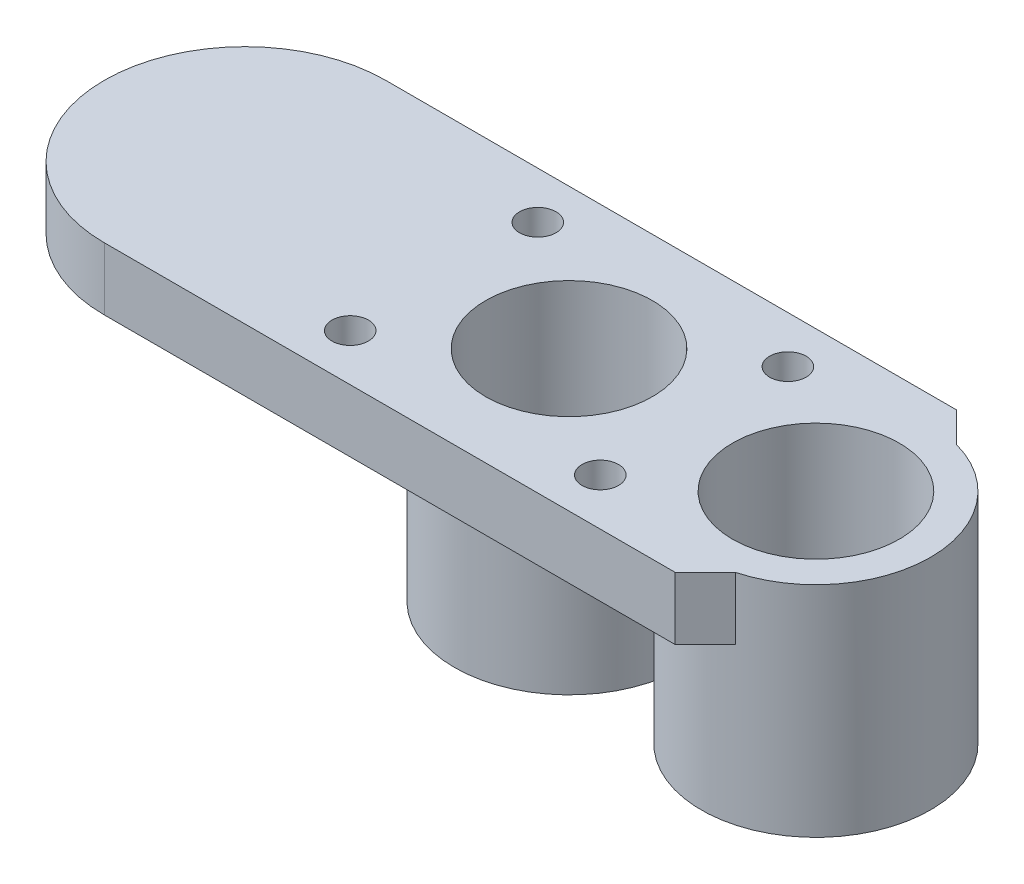
ISO-10303-21;
HEADER;
FILE_DESCRIPTION(('STEP AP214'),'2;1');
FILE_NAME('part.step','',(''),(''),'','','');
FILE_SCHEMA(('AUTOMOTIVE_DESIGN { 1 0 10303 214 1 1 1 1 }'));
ENDSEC;
DATA;
#1=APPLICATION_CONTEXT('core data for automotive mechanical design processes');
#2=APPLICATION_PROTOCOL_DEFINITION('international standard','automotive_design',2000,#1);
#3=PRODUCT_CONTEXT('',#1,'mechanical');
#4=PRODUCT('Part','Part','',(#3));
#5=PRODUCT_RELATED_PRODUCT_CATEGORY('part','',(#4));
#6=PRODUCT_DEFINITION_FORMATION('','',#4);
#7=PRODUCT_DEFINITION_CONTEXT('part definition',#1,'design');
#8=PRODUCT_DEFINITION('design','',#6,#7);
#9=PRODUCT_DEFINITION_SHAPE('','',#8);
#10=(LENGTH_UNIT() NAMED_UNIT(*) SI_UNIT(.MILLI.,.METRE.));
#11=(NAMED_UNIT(*) PLANE_ANGLE_UNIT() SI_UNIT($,.RADIAN.));
#12=(NAMED_UNIT(*) SI_UNIT($,.STERADIAN.) SOLID_ANGLE_UNIT());
#13=UNCERTAINTY_MEASURE_WITH_UNIT(LENGTH_MEASURE(1.E-05),#10,'distance_accuracy_value','');
#14=(GEOMETRIC_REPRESENTATION_CONTEXT(3) GLOBAL_UNCERTAINTY_ASSIGNED_CONTEXT((#13)) GLOBAL_UNIT_ASSIGNED_CONTEXT((#10,
#11,#12)) REPRESENTATION_CONTEXT('',''));
#15=CARTESIAN_POINT('',(0.,0.,0.));
#16=DIRECTION('',(0.,0.,1.));
#17=DIRECTION('',(1.,0.,0.));
#18=AXIS2_PLACEMENT_3D('',#15,#16,#17);
#19=CARTESIAN_POINT('',(12.,6.,-9.));
#20=DIRECTION('',(0.,-1.,0.));
#21=DIRECTION('',(0.,0.,-1.));
#22=AXIS2_PLACEMENT_3D('',#19,#20,#21);
#23=CYLINDRICAL_SURFACE('',#22,1.75);
#24=CARTESIAN_POINT('',(12.,6.,-9.));
#25=DIRECTION('',(0.,1.,0.));
#26=DIRECTION('',(0.,0.,1.));
#27=AXIS2_PLACEMENT_3D('',#24,#25,#26);
#28=CIRCLE('',#27,1.75);
#29=CARTESIAN_POINT('',(12.,6.,-7.25));
#30=VERTEX_POINT('',#29);
#31=EDGE_CURVE('E105',#30,#30,#28,.T.);
#32=ORIENTED_EDGE('',*,*,#31,.T.);
#33=EDGE_LOOP('',(#32));
#34=FACE_BOUND('',#33,.T.);
#35=CARTESIAN_POINT('',(12.,3.,-9.));
#36=DIRECTION('',(0.,-1.,0.));
#37=DIRECTION('',(0.,0.,-1.));
#38=AXIS2_PLACEMENT_3D('',#35,#36,#37);
#39=CIRCLE('',#38,1.75);
#40=CARTESIAN_POINT('',(12.,3.,-10.75));
#41=VERTEX_POINT('',#40);
#42=EDGE_CURVE('E138',#41,#41,#39,.T.);
#43=ORIENTED_EDGE('',*,*,#42,.T.);
#44=EDGE_LOOP('',(#43));
#45=FACE_BOUND('',#44,.T.);
#46=ADVANCED_FACE('F41',(#34,#45),#23,.F.);
#47=CARTESIAN_POINT('',(12.,6.,9.));
#48=DIRECTION('',(0.,-1.,0.));
#49=DIRECTION('',(0.,0.,-1.));
#50=AXIS2_PLACEMENT_3D('',#47,#48,#49);
#51=CYLINDRICAL_SURFACE('',#50,1.75);
#52=CARTESIAN_POINT('',(12.,6.,9.));
#53=DIRECTION('',(0.,1.,0.));
#54=DIRECTION('',(0.,0.,1.));
#55=AXIS2_PLACEMENT_3D('',#52,#53,#54);
#56=CIRCLE('',#55,1.75);
#57=CARTESIAN_POINT('',(12.,6.,10.75));
#58=VERTEX_POINT('',#57);
#59=EDGE_CURVE('E197',#58,#58,#56,.T.);
#60=ORIENTED_EDGE('',*,*,#59,.T.);
#61=EDGE_LOOP('',(#60));
#62=FACE_BOUND('',#61,.T.);
#63=CARTESIAN_POINT('',(12.,3.,9.));
#64=DIRECTION('',(0.,-1.,0.));
#65=DIRECTION('',(0.,0.,-1.));
#66=AXIS2_PLACEMENT_3D('',#63,#64,#65);
#67=CIRCLE('',#66,1.75);
#68=CARTESIAN_POINT('',(12.,3.,7.25));
#69=VERTEX_POINT('',#68);
#70=EDGE_CURVE('E154',#69,#69,#67,.T.);
#71=ORIENTED_EDGE('',*,*,#70,.T.);
#72=EDGE_LOOP('',(#71));
#73=FACE_BOUND('',#72,.T.);
#74=ADVANCED_FACE('F257',(#62,#73),#51,.F.);
#75=CARTESIAN_POINT('',(-12.,6.,9.));
#76=DIRECTION('',(0.,-1.,0.));
#77=DIRECTION('',(0.,0.,-1.));
#78=AXIS2_PLACEMENT_3D('',#75,#76,#77);
#79=CYLINDRICAL_SURFACE('',#78,1.75);
#80=CARTESIAN_POINT('',(-12.,6.,9.));
#81=DIRECTION('',(0.,1.,0.));
#82=DIRECTION('',(0.,0.,1.));
#83=AXIS2_PLACEMENT_3D('',#80,#81,#82);
#84=CIRCLE('',#83,1.75);
#85=CARTESIAN_POINT('',(-12.,6.,10.75));
#86=VERTEX_POINT('',#85);
#87=EDGE_CURVE('E192',#86,#86,#84,.T.);
#88=ORIENTED_EDGE('',*,*,#87,.T.);
#89=EDGE_LOOP('',(#88));
#90=FACE_BOUND('',#89,.T.);
#91=CARTESIAN_POINT('',(-12.,3.,9.));
#92=DIRECTION('',(0.,-1.,0.));
#93=DIRECTION('',(0.,0.,-1.));
#94=AXIS2_PLACEMENT_3D('',#91,#92,#93);
#95=CIRCLE('',#94,1.75);
#96=CARTESIAN_POINT('',(-12.,3.,7.25));
#97=VERTEX_POINT('',#96);
#98=EDGE_CURVE('E140',#97,#97,#95,.T.);
#99=ORIENTED_EDGE('',*,*,#98,.T.);
#100=EDGE_LOOP('',(#99));
#101=FACE_BOUND('',#100,.T.);
#102=ADVANCED_FACE('F263',(#90,#101),#79,.F.);
#103=CARTESIAN_POINT('',(-12.,6.,-9.));
#104=DIRECTION('',(0.,-1.,0.));
#105=DIRECTION('',(0.,0.,-1.));
#106=AXIS2_PLACEMENT_3D('',#103,#104,#105);
#107=CYLINDRICAL_SURFACE('',#106,1.75);
#108=CARTESIAN_POINT('',(-12.,6.,-9.));
#109=DIRECTION('',(0.,1.,0.));
#110=DIRECTION('',(0.,0.,1.));
#111=AXIS2_PLACEMENT_3D('',#108,#109,#110);
#112=CIRCLE('',#111,1.75);
#113=CARTESIAN_POINT('',(-12.,6.,-7.25));
#114=VERTEX_POINT('',#113);
#115=EDGE_CURVE('E188',#114,#114,#112,.T.);
#116=ORIENTED_EDGE('',*,*,#115,.T.);
#117=EDGE_LOOP('',(#116));
#118=FACE_BOUND('',#117,.T.);
#119=CARTESIAN_POINT('',(-12.,3.,-9.));
#120=DIRECTION('',(0.,-1.,0.));
#121=DIRECTION('',(0.,0.,-1.));
#122=AXIS2_PLACEMENT_3D('',#119,#120,#121);
#123=CIRCLE('',#122,1.75);
#124=CARTESIAN_POINT('',(-12.,3.,-10.75));
#125=VERTEX_POINT('',#124);
#126=EDGE_CURVE('E150',#125,#125,#123,.T.);
#127=ORIENTED_EDGE('',*,*,#126,.T.);
#128=EDGE_LOOP('',(#127));
#129=FACE_BOUND('',#128,.T.);
#130=ADVANCED_FACE('F271',(#118,#129),#107,.F.);
#131=CARTESIAN_POINT('',(0.,6.,13.5));
#132=DIRECTION('',(0.,0.,-1.));
#133=DIRECTION('',(-1.,0.,0.));
#134=AXIS2_PLACEMENT_3D('',#131,#132,#133);
#135=PLANE('',#134);
#136=DIRECTION('',(1.,0.,0.));
#137=VECTOR('',#136,1.);
#138=CARTESIAN_POINT('',(0.,0.,13.5));
#139=LINE('',#138,#137);
#140=CARTESIAN_POINT('',(-31.1,0.,13.5));
#141=VERTEX_POINT('',#140);
#142=CARTESIAN_POINT('',(23.69,0.,13.5));
#143=VERTEX_POINT('',#142);
#144=EDGE_CURVE('E184',#141,#143,#139,.T.);
#145=ORIENTED_EDGE('',*,*,#144,.T.);
#146=DIRECTION('',(0.,-1.,0.));
#147=VECTOR('',#146,1.);
#148=CARTESIAN_POINT('',(23.69,6.,13.5));
#149=LINE('',#148,#147);
#150=CARTESIAN_POINT('',(23.69,6.,13.5));
#151=VERTEX_POINT('',#150);
#152=EDGE_CURVE('E99',#151,#143,#149,.T.);
#153=ORIENTED_EDGE('',*,*,#152,.F.);
#154=DIRECTION('',(1.,0.,0.));
#155=VECTOR('',#154,1.);
#156=CARTESIAN_POINT('',(0.,6.,13.5));
#157=LINE('',#156,#155);
#158=CARTESIAN_POINT('',(-31.1,6.,13.5));
#159=VERTEX_POINT('',#158);
#160=EDGE_CURVE('E92',#159,#151,#157,.T.);
#161=ORIENTED_EDGE('',*,*,#160,.F.);
#162=DIRECTION('',(0.,-1.,0.));
#163=VECTOR('',#162,1.);
#164=CARTESIAN_POINT('',(-31.1,6.,13.5));
#165=LINE('',#164,#163);
#166=EDGE_CURVE('E96',#159,#141,#165,.T.);
#167=ORIENTED_EDGE('',*,*,#166,.T.);
#168=EDGE_LOOP('',(#145,#153,#161,#167));
#169=FACE_BOUND('',#168,.T.);
#170=ADVANCED_FACE('F95',(#169),#135,.F.);
#171=CARTESIAN_POINT('',(23.69,6.,0.));
#172=DIRECTION('',(0.,-1.,0.));
#173=DIRECTION('',(0.,0.,-1.));
#174=AXIS2_PLACEMENT_3D('',#171,#172,#173);
#175=CYLINDRICAL_SURFACE('',#174,11.);
#176=CARTESIAN_POINT('',(23.69,6.,0.));
#177=DIRECTION('',(0.,1.,0.));
#178=DIRECTION('',(0.,0.,1.));
#179=AXIS2_PLACEMENT_3D('',#176,#177,#178);
#180=CIRCLE('',#179,11.);
#181=CARTESIAN_POINT('',(26.5750937915649,6.,10.6149062084351));
#182=VERTEX_POINT('',#181);
#183=CARTESIAN_POINT('',(26.5750937915649,6.,-10.6149062084351));
#184=VERTEX_POINT('',#183);
#185=EDGE_CURVE('E104',#182,#184,#180,.T.);
#186=ORIENTED_EDGE('',*,*,#185,.F.);
#187=DIRECTION('',(0.,-1.,0.));
#188=VECTOR('',#187,1.);
#189=CARTESIAN_POINT('',(26.5750937915649,6.,10.6149062084351));
#190=LINE('',#189,#188);
#191=CARTESIAN_POINT('',(26.5750937915649,0.,10.6149062084351));
#192=VERTEX_POINT('',#191);
#193=EDGE_CURVE('E225',#182,#192,#190,.T.);
#194=ORIENTED_EDGE('',*,*,#193,.T.);
#195=CARTESIAN_POINT('',(23.69,0.,0.));
#196=DIRECTION('',(0.,1.,0.));
#197=DIRECTION('',(0.,0.,1.));
#198=AXIS2_PLACEMENT_3D('',#195,#196,#197);
#199=CIRCLE('',#198,11.);
#200=CARTESIAN_POINT('',(26.5750937915649,0.,-10.6149062084351));
#201=VERTEX_POINT('',#200);
#202=EDGE_CURVE('E57',#201,#192,#199,.T.);
#203=ORIENTED_EDGE('',*,*,#202,.F.);
#204=DIRECTION('',(0.,-1.,0.));
#205=VECTOR('',#204,1.);
#206=CARTESIAN_POINT('',(26.5750937915649,6.,-10.6149062084351));
#207=LINE('',#206,#205);
#208=EDGE_CURVE('E115',#201,#184,#207,.F.);
#209=ORIENTED_EDGE('',*,*,#208,.T.);
#210=EDGE_LOOP('',(#186,#194,#203,#209));
#211=FACE_BOUND('',#210,.T.);
#212=CARTESIAN_POINT('',(23.69,-15.,0.));
#213=DIRECTION('',(0.,-1.,0.));
#214=DIRECTION('',(0.,0.,-1.));
#215=AXIS2_PLACEMENT_3D('',#212,#213,#214);
#216=CIRCLE('',#215,11.);
#217=CARTESIAN_POINT('',(23.69,-15.,-11.));
#218=VERTEX_POINT('',#217);
#219=EDGE_CURVE('E608',#218,#218,#216,.T.);
#220=ORIENTED_EDGE('',*,*,#219,.F.);
#221=EDGE_LOOP('',(#220));
#222=FACE_BOUND('',#221,.T.);
#223=ADVANCED_FACE('F241',(#211,#222),#175,.T.);
#224=CARTESIAN_POINT('',(0.,6.,-13.5));
#225=DIRECTION('',(0.,0.,-1.));
#226=DIRECTION('',(-1.,0.,0.));
#227=AXIS2_PLACEMENT_3D('',#224,#225,#226);
#228=PLANE('',#227);
#229=DIRECTION('',(1.,0.,0.));
#230=VECTOR('',#229,1.);
#231=CARTESIAN_POINT('',(0.,0.,-13.5));
#232=LINE('',#231,#230);
#233=CARTESIAN_POINT('',(-31.1,0.,-13.5));
#234=VERTEX_POINT('',#233);
#235=CARTESIAN_POINT('',(23.69,0.,-13.5));
#236=VERTEX_POINT('',#235);
#237=EDGE_CURVE('E193',#234,#236,#232,.T.);
#238=ORIENTED_EDGE('',*,*,#237,.F.);
#239=DIRECTION('',(0.,-1.,0.));
#240=VECTOR('',#239,1.);
#241=CARTESIAN_POINT('',(-31.1,6.,-13.5));
#242=LINE('',#241,#240);
#243=CARTESIAN_POINT('',(-31.1,6.,-13.5));
#244=VERTEX_POINT('',#243);
#245=EDGE_CURVE('E209',#244,#234,#242,.T.);
#246=ORIENTED_EDGE('',*,*,#245,.F.);
#247=DIRECTION('',(1.,0.,0.));
#248=VECTOR('',#247,1.);
#249=CARTESIAN_POINT('',(0.,6.,-13.5));
#250=LINE('',#249,#248);
#251=CARTESIAN_POINT('',(23.69,6.,-13.5));
#252=VERTEX_POINT('',#251);
#253=EDGE_CURVE('E121',#244,#252,#250,.T.);
#254=ORIENTED_EDGE('',*,*,#253,.T.);
#255=DIRECTION('',(0.,-1.,0.));
#256=VECTOR('',#255,1.);
#257=CARTESIAN_POINT('',(23.69,6.,-13.5));
#258=LINE('',#257,#256);
#259=EDGE_CURVE('E217',#252,#236,#258,.T.);
#260=ORIENTED_EDGE('',*,*,#259,.T.);
#261=EDGE_LOOP('',(#238,#246,#254,#260));
#262=FACE_BOUND('',#261,.T.);
#263=ADVANCED_FACE('F301',(#262),#228,.T.);
#264=CARTESIAN_POINT('',(0.,6.,0.));
#265=DIRECTION('',(0.,1.,0.));
#266=DIRECTION('',(0.,0.,1.));
#267=AXIS2_PLACEMENT_3D('',#264,#265,#266);
#268=PLANE('',#267);
#269=CARTESIAN_POINT('',(-31.1,6.,0.));
#270=DIRECTION('',(0.,1.,0.));
#271=DIRECTION('',(0.,0.,1.));
#272=AXIS2_PLACEMENT_3D('',#269,#270,#271);
#273=CIRCLE('',#272,13.5);
#274=EDGE_CURVE('E111',#244,#159,#273,.T.);
#275=ORIENTED_EDGE('',*,*,#274,.T.);
#276=ORIENTED_EDGE('',*,*,#160,.T.);
#277=DIRECTION('',(0.70710678118655,0.,-0.707106781186545));
#278=VECTOR('',#277,1.);
#279=CARTESIAN_POINT('',(26.5750937915649,6.,10.6149062084351));
#280=LINE('',#279,#278);
#281=EDGE_CURVE('E231',#151,#182,#280,.T.);
#282=ORIENTED_EDGE('',*,*,#281,.T.);
#283=ORIENTED_EDGE('',*,*,#185,.T.);
#284=DIRECTION('',(-0.707106781186543,0.,-0.707106781186552));
#285=VECTOR('',#284,1.);
#286=CARTESIAN_POINT('',(23.69,6.,-13.5));
#287=LINE('',#286,#285);
#288=EDGE_CURVE('E11',#184,#252,#287,.T.);
#289=ORIENTED_EDGE('',*,*,#288,.T.);
#290=ORIENTED_EDGE('',*,*,#253,.F.);
#291=EDGE_LOOP('',(#275,#276,#282,#283,#289,#290));
#292=FACE_BOUND('',#291,.T.);
#293=CARTESIAN_POINT('',(0.,6.,0.));
#294=DIRECTION('',(0.,1.,0.));
#295=DIRECTION('',(0.,0.,1.));
#296=AXIS2_PLACEMENT_3D('',#293,#294,#295);
#297=CIRCLE('',#296,8.);
#298=CARTESIAN_POINT('',(0.,6.,8.));
#299=VERTEX_POINT('',#298);
#300=EDGE_CURVE('E128',#299,#299,#297,.T.);
#301=ORIENTED_EDGE('',*,*,#300,.F.);
#302=EDGE_LOOP('',(#301));
#303=FACE_BOUND('',#302,.T.);
#304=CARTESIAN_POINT('',(23.69,6.,0.));
#305=DIRECTION('',(0.,1.,0.));
#306=DIRECTION('',(0.,0.,1.));
#307=AXIS2_PLACEMENT_3D('',#304,#305,#306);
#308=CIRCLE('',#307,8.);
#309=CARTESIAN_POINT('',(23.69,6.,8.));
#310=VERTEX_POINT('',#309);
#311=EDGE_CURVE('E123',#310,#310,#308,.T.);
#312=ORIENTED_EDGE('',*,*,#311,.F.);
#313=EDGE_LOOP('',(#312));
#314=FACE_BOUND('',#313,.T.);
#315=ORIENTED_EDGE('',*,*,#115,.F.);
#316=EDGE_LOOP('',(#315));
#317=FACE_BOUND('',#316,.T.);
#318=ORIENTED_EDGE('',*,*,#87,.F.);
#319=EDGE_LOOP('',(#318));
#320=FACE_BOUND('',#319,.T.);
#321=ORIENTED_EDGE('',*,*,#59,.F.);
#322=EDGE_LOOP('',(#321));
#323=FACE_BOUND('',#322,.T.);
#324=ORIENTED_EDGE('',*,*,#31,.F.);
#325=EDGE_LOOP('',(#324));
#326=FACE_BOUND('',#325,.T.);
#327=ADVANCED_FACE('F118',(#292,#303,#314,#317,#320,#323,#326),#268,.T.);
#328=CARTESIAN_POINT('',(0.,0.,0.));
#329=DIRECTION('',(0.,1.,0.));
#330=DIRECTION('',(0.,0.,1.));
#331=AXIS2_PLACEMENT_3D('',#328,#329,#330);
#332=PLANE('',#331);
#333=CARTESIAN_POINT('',(0.,0.,0.));
#334=DIRECTION('',(0.,1.,0.));
#335=DIRECTION('',(0.,0.,1.));
#336=AXIS2_PLACEMENT_3D('',#333,#334,#335);
#337=CIRCLE('',#336,11.);
#338=CARTESIAN_POINT('',(0.,0.,11.));
#339=VERTEX_POINT('',#338);
#340=EDGE_CURVE('E133',#339,#339,#337,.T.);
#341=ORIENTED_EDGE('',*,*,#340,.T.);
#342=EDGE_LOOP('',(#341));
#343=FACE_BOUND('',#342,.T.);
#344=ORIENTED_EDGE('',*,*,#237,.T.);
#345=DIRECTION('',(0.707106781186543,0.,0.707106781186552));
#346=VECTOR('',#345,1.);
#347=CARTESIAN_POINT('',(18.5950000000002,0.,-18.5949999999999));
#348=LINE('',#347,#346);
#349=EDGE_CURVE('E50',#236,#201,#348,.T.);
#350=ORIENTED_EDGE('',*,*,#349,.T.);
#351=ORIENTED_EDGE('',*,*,#202,.T.);
#352=DIRECTION('',(-0.70710678118655,0.,0.707106781186545));
#353=VECTOR('',#352,1.);
#354=CARTESIAN_POINT('',(18.5949999999999,0.,18.595));
#355=LINE('',#354,#353);
#356=EDGE_CURVE('E228',#192,#143,#355,.T.);
#357=ORIENTED_EDGE('',*,*,#356,.T.);
#358=ORIENTED_EDGE('',*,*,#144,.F.);
#359=CARTESIAN_POINT('',(-31.1,0.,0.));
#360=DIRECTION('',(0.,1.,0.));
#361=DIRECTION('',(0.,0.,1.));
#362=AXIS2_PLACEMENT_3D('',#359,#360,#361);
#363=CIRCLE('',#362,13.5);
#364=EDGE_CURVE('E113',#234,#141,#363,.T.);
#365=ORIENTED_EDGE('',*,*,#364,.F.);
#366=EDGE_LOOP('',(#344,#350,#351,#357,#358,#365));
#367=FACE_BOUND('',#366,.T.);
#368=CARTESIAN_POINT('',(12.,0.,-9.));
#369=DIRECTION('',(0.,-1.,0.));
#370=DIRECTION('',(0.,0.,-1.));
#371=AXIS2_PLACEMENT_3D('',#368,#369,#370);
#372=CIRCLE('',#371,3.);
#373=CARTESIAN_POINT('',(12.,0.,-12.));
#374=VERTEX_POINT('',#373);
#375=EDGE_CURVE('E169',#374,#374,#372,.T.);
#376=ORIENTED_EDGE('',*,*,#375,.F.);
#377=EDGE_LOOP('',(#376));
#378=FACE_BOUND('',#377,.T.);
#379=CARTESIAN_POINT('',(12.,0.,9.));
#380=DIRECTION('',(0.,-1.,0.));
#381=DIRECTION('',(0.,0.,-1.));
#382=AXIS2_PLACEMENT_3D('',#379,#380,#381);
#383=CIRCLE('',#382,3.);
#384=CARTESIAN_POINT('',(12.,0.,6.));
#385=VERTEX_POINT('',#384);
#386=EDGE_CURVE('E158',#385,#385,#383,.T.);
#387=ORIENTED_EDGE('',*,*,#386,.F.);
#388=EDGE_LOOP('',(#387));
#389=FACE_BOUND('',#388,.T.);
#390=CARTESIAN_POINT('',(-12.,0.,9.));
#391=DIRECTION('',(0.,-1.,0.));
#392=DIRECTION('',(0.,0.,-1.));
#393=AXIS2_PLACEMENT_3D('',#390,#391,#392);
#394=CIRCLE('',#393,3.);
#395=CARTESIAN_POINT('',(-12.,0.,6.));
#396=VERTEX_POINT('',#395);
#397=EDGE_CURVE('E144',#396,#396,#394,.T.);
#398=ORIENTED_EDGE('',*,*,#397,.F.);
#399=EDGE_LOOP('',(#398));
#400=FACE_BOUND('',#399,.T.);
#401=CARTESIAN_POINT('',(-12.,0.,-9.));
#402=DIRECTION('',(0.,-1.,0.));
#403=DIRECTION('',(0.,0.,-1.));
#404=AXIS2_PLACEMENT_3D('',#401,#402,#403);
#405=CIRCLE('',#404,3.);
#406=CARTESIAN_POINT('',(-12.,0.,-12.));
#407=VERTEX_POINT('',#406);
#408=EDGE_CURVE('E179',#407,#407,#405,.T.);
#409=ORIENTED_EDGE('',*,*,#408,.F.);
#410=EDGE_LOOP('',(#409));
#411=FACE_BOUND('',#410,.T.);
#412=ADVANCED_FACE('F235',(#343,#367,#378,#389,#400,#411),#332,.F.);
#413=CARTESIAN_POINT('',(-12.,3.,-9.));
#414=DIRECTION('',(0.,-1.,0.));
#415=DIRECTION('',(0.,0.,-1.));
#416=AXIS2_PLACEMENT_3D('',#413,#414,#415);
#417=CYLINDRICAL_SURFACE('',#416,3.);
#418=CARTESIAN_POINT('',(-12.,3.,-9.));
#419=DIRECTION('',(0.,-1.,0.));
#420=DIRECTION('',(0.,0.,-1.));
#421=AXIS2_PLACEMENT_3D('',#418,#419,#420);
#422=CIRCLE('',#421,3.);
#423=CARTESIAN_POINT('',(-12.,3.,-12.));
#424=VERTEX_POINT('',#423);
#425=EDGE_CURVE('E180',#424,#424,#422,.T.);
#426=ORIENTED_EDGE('',*,*,#425,.F.);
#427=EDGE_LOOP('',(#426));
#428=FACE_BOUND('',#427,.T.);
#429=ORIENTED_EDGE('',*,*,#408,.T.);
#430=EDGE_LOOP('',(#429));
#431=FACE_BOUND('',#430,.T.);
#432=ADVANCED_FACE('F286',(#428,#431),#417,.F.);
#433=CARTESIAN_POINT('',(-12.,3.,-9.));
#434=DIRECTION('',(0.,-1.,0.));
#435=DIRECTION('',(0.,0.,-1.));
#436=AXIS2_PLACEMENT_3D('',#433,#434,#435);
#437=PLANE('',#436);
#438=ORIENTED_EDGE('',*,*,#126,.F.);
#439=EDGE_LOOP('',(#438));
#440=FACE_BOUND('',#439,.T.);
#441=ORIENTED_EDGE('',*,*,#425,.T.);
#442=EDGE_LOOP('',(#441));
#443=FACE_BOUND('',#442,.T.);
#444=ADVANCED_FACE('F282',(#440,#443),#437,.T.);
#445=CARTESIAN_POINT('',(-12.,3.,9.));
#446=DIRECTION('',(0.,-1.,0.));
#447=DIRECTION('',(0.,0.,-1.));
#448=AXIS2_PLACEMENT_3D('',#445,#446,#447);
#449=CYLINDRICAL_SURFACE('',#448,3.);
#450=CARTESIAN_POINT('',(-12.,3.,9.));
#451=DIRECTION('',(0.,-1.,0.));
#452=DIRECTION('',(0.,0.,-1.));
#453=AXIS2_PLACEMENT_3D('',#450,#451,#452);
#454=CIRCLE('',#453,3.);
#455=CARTESIAN_POINT('',(-12.,3.,6.));
#456=VERTEX_POINT('',#455);
#457=EDGE_CURVE('E146',#456,#456,#454,.T.);
#458=ORIENTED_EDGE('',*,*,#457,.F.);
#459=EDGE_LOOP('',(#458));
#460=FACE_BOUND('',#459,.T.);
#461=ORIENTED_EDGE('',*,*,#397,.T.);
#462=EDGE_LOOP('',(#461));
#463=FACE_BOUND('',#462,.T.);
#464=ADVANCED_FACE('F285',(#460,#463),#449,.F.);
#465=CARTESIAN_POINT('',(-12.,3.,9.));
#466=DIRECTION('',(0.,-1.,0.));
#467=DIRECTION('',(0.,0.,-1.));
#468=AXIS2_PLACEMENT_3D('',#465,#466,#467);
#469=PLANE('',#468);
#470=ORIENTED_EDGE('',*,*,#98,.F.);
#471=EDGE_LOOP('',(#470));
#472=FACE_BOUND('',#471,.T.);
#473=ORIENTED_EDGE('',*,*,#457,.T.);
#474=EDGE_LOOP('',(#473));
#475=FACE_BOUND('',#474,.T.);
#476=ADVANCED_FACE('F491',(#472,#475),#469,.T.);
#477=CARTESIAN_POINT('',(12.,3.,9.));
#478=DIRECTION('',(0.,-1.,0.));
#479=DIRECTION('',(0.,0.,-1.));
#480=AXIS2_PLACEMENT_3D('',#477,#478,#479);
#481=CYLINDRICAL_SURFACE('',#480,3.);
#482=CARTESIAN_POINT('',(12.,3.,9.));
#483=DIRECTION('',(0.,-1.,0.));
#484=DIRECTION('',(0.,0.,-1.));
#485=AXIS2_PLACEMENT_3D('',#482,#483,#484);
#486=CIRCLE('',#485,3.);
#487=CARTESIAN_POINT('',(12.,3.,6.));
#488=VERTEX_POINT('',#487);
#489=EDGE_CURVE('E145',#488,#488,#486,.T.);
#490=ORIENTED_EDGE('',*,*,#489,.F.);
#491=EDGE_LOOP('',(#490));
#492=FACE_BOUND('',#491,.T.);
#493=ORIENTED_EDGE('',*,*,#386,.T.);
#494=EDGE_LOOP('',(#493));
#495=FACE_BOUND('',#494,.T.);
#496=ADVANCED_FACE('F481',(#492,#495),#481,.F.);
#497=CARTESIAN_POINT('',(12.,3.,9.));
#498=DIRECTION('',(0.,-1.,0.));
#499=DIRECTION('',(0.,0.,-1.));
#500=AXIS2_PLACEMENT_3D('',#497,#498,#499);
#501=PLANE('',#500);
#502=ORIENTED_EDGE('',*,*,#70,.F.);
#503=EDGE_LOOP('',(#502));
#504=FACE_BOUND('',#503,.T.);
#505=ORIENTED_EDGE('',*,*,#489,.T.);
#506=EDGE_LOOP('',(#505));
#507=FACE_BOUND('',#506,.T.);
#508=ADVANCED_FACE('F471',(#504,#507),#501,.T.);
#509=CARTESIAN_POINT('',(12.,3.,-9.));
#510=DIRECTION('',(0.,-1.,0.));
#511=DIRECTION('',(0.,0.,-1.));
#512=AXIS2_PLACEMENT_3D('',#509,#510,#511);
#513=CYLINDRICAL_SURFACE('',#512,3.);
#514=CARTESIAN_POINT('',(12.,3.,-9.));
#515=DIRECTION('',(0.,-1.,0.));
#516=DIRECTION('',(0.,0.,-1.));
#517=AXIS2_PLACEMENT_3D('',#514,#515,#516);
#518=CIRCLE('',#517,3.);
#519=CARTESIAN_POINT('',(12.,3.,-12.));
#520=VERTEX_POINT('',#519);
#521=EDGE_CURVE('E159',#520,#520,#518,.T.);
#522=ORIENTED_EDGE('',*,*,#521,.F.);
#523=EDGE_LOOP('',(#522));
#524=FACE_BOUND('',#523,.T.);
#525=ORIENTED_EDGE('',*,*,#375,.T.);
#526=EDGE_LOOP('',(#525));
#527=FACE_BOUND('',#526,.T.);
#528=ADVANCED_FACE('F460',(#524,#527),#513,.F.);
#529=CARTESIAN_POINT('',(12.,3.,-9.));
#530=DIRECTION('',(0.,-1.,0.));
#531=DIRECTION('',(0.,0.,-1.));
#532=AXIS2_PLACEMENT_3D('',#529,#530,#531);
#533=PLANE('',#532);
#534=ORIENTED_EDGE('',*,*,#42,.F.);
#535=EDGE_LOOP('',(#534));
#536=FACE_BOUND('',#535,.T.);
#537=ORIENTED_EDGE('',*,*,#521,.T.);
#538=EDGE_LOOP('',(#537));
#539=FACE_BOUND('',#538,.T.);
#540=ADVANCED_FACE('F423',(#536,#539),#533,.T.);
#541=CARTESIAN_POINT('',(23.69,3.,0.));
#542=DIRECTION('',(0.,1.,0.));
#543=DIRECTION('',(0.,0.,1.));
#544=AXIS2_PLACEMENT_3D('',#541,#542,#543);
#545=CYLINDRICAL_SURFACE('',#544,8.);
#546=ORIENTED_EDGE('',*,*,#311,.T.);
#547=EDGE_LOOP('',(#546));
#548=FACE_BOUND('',#547,.T.);
#549=CARTESIAN_POINT('',(23.69,-12.,0.));
#550=DIRECTION('',(0.,1.,0.));
#551=DIRECTION('',(0.,0.,1.));
#552=AXIS2_PLACEMENT_3D('',#549,#550,#551);
#553=CIRCLE('',#552,8.);
#554=CARTESIAN_POINT('',(23.69,-12.,8.));
#555=VERTEX_POINT('',#554);
#556=EDGE_CURVE('E604',#555,#555,#553,.T.);
#557=ORIENTED_EDGE('',*,*,#556,.F.);
#558=EDGE_LOOP('',(#557));
#559=FACE_BOUND('',#558,.T.);
#560=ADVANCED_FACE('F416',(#548,#559),#545,.F.);
#561=CARTESIAN_POINT('',(0.,3.,0.));
#562=DIRECTION('',(0.,1.,0.));
#563=DIRECTION('',(0.,0.,1.));
#564=AXIS2_PLACEMENT_3D('',#561,#562,#563);
#565=CYLINDRICAL_SURFACE('',#564,8.);
#566=ORIENTED_EDGE('',*,*,#300,.T.);
#567=EDGE_LOOP('',(#566));
#568=FACE_BOUND('',#567,.T.);
#569=CARTESIAN_POINT('',(0.,-12.,0.));
#570=DIRECTION('',(0.,1.,0.));
#571=DIRECTION('',(0.,0.,1.));
#572=AXIS2_PLACEMENT_3D('',#569,#570,#571);
#573=CIRCLE('',#572,8.);
#574=CARTESIAN_POINT('',(0.,-12.,8.));
#575=VERTEX_POINT('',#574);
#576=EDGE_CURVE('E130',#575,#575,#573,.T.);
#577=ORIENTED_EDGE('',*,*,#576,.F.);
#578=EDGE_LOOP('',(#577));
#579=FACE_BOUND('',#578,.T.);
#580=ADVANCED_FACE('F422',(#568,#579),#565,.F.);
#581=CARTESIAN_POINT('',(-31.1,6.,0.));
#582=DIRECTION('',(0.,-1.,0.));
#583=DIRECTION('',(0.,0.,-1.));
#584=AXIS2_PLACEMENT_3D('',#581,#582,#583);
#585=CYLINDRICAL_SURFACE('',#584,13.5);
#586=ORIENTED_EDGE('',*,*,#364,.T.);
#587=ORIENTED_EDGE('',*,*,#166,.F.);
#588=ORIENTED_EDGE('',*,*,#274,.F.);
#589=ORIENTED_EDGE('',*,*,#245,.T.);
#590=EDGE_LOOP('',(#586,#587,#588,#589));
#591=FACE_BOUND('',#590,.T.);
#592=ADVANCED_FACE('F109',(#591),#585,.T.);
#593=CARTESIAN_POINT('',(0.,-12.,0.));
#594=DIRECTION('',(0.,1.,0.));
#595=DIRECTION('',(0.,0.,1.));
#596=AXIS2_PLACEMENT_3D('',#593,#594,#595);
#597=CYLINDRICAL_SURFACE('',#596,11.);
#598=ORIENTED_EDGE('',*,*,#340,.F.);
#599=EDGE_LOOP('',(#598));
#600=FACE_BOUND('',#599,.T.);
#601=CARTESIAN_POINT('',(0.,-15.,0.));
#602=DIRECTION('',(0.,-1.,0.));
#603=DIRECTION('',(0.,0.,-1.));
#604=AXIS2_PLACEMENT_3D('',#601,#602,#603);
#605=CIRCLE('',#604,11.);
#606=CARTESIAN_POINT('',(0.,-15.,-11.));
#607=VERTEX_POINT('',#606);
#608=EDGE_CURVE('E620',#607,#607,#605,.T.);
#609=ORIENTED_EDGE('',*,*,#608,.F.);
#610=EDGE_LOOP('',(#609));
#611=FACE_BOUND('',#610,.T.);
#612=ADVANCED_FACE('F389',(#600,#611),#597,.T.);
#613=CARTESIAN_POINT('',(23.69,-12.,0.));
#614=DIRECTION('',(0.,-1.,0.));
#615=DIRECTION('',(0.,0.,-1.));
#616=AXIS2_PLACEMENT_3D('',#613,#614,#615);
#617=PLANE('',#616);
#618=CARTESIAN_POINT('',(23.69,-12.,0.));
#619=DIRECTION('',(0.,-1.,0.));
#620=DIRECTION('',(0.,0.,-1.));
#621=AXIS2_PLACEMENT_3D('',#618,#619,#620);
#622=CIRCLE('',#621,5.);
#623=CARTESIAN_POINT('',(23.69,-12.,-5.));
#624=VERTEX_POINT('',#623);
#625=EDGE_CURVE('E616',#624,#624,#622,.T.);
#626=ORIENTED_EDGE('',*,*,#625,.T.);
#627=EDGE_LOOP('',(#626));
#628=FACE_BOUND('',#627,.T.);
#629=ORIENTED_EDGE('',*,*,#556,.T.);
#630=EDGE_LOOP('',(#629));
#631=FACE_BOUND('',#630,.T.);
#632=ADVANCED_FACE('F380',(#628,#631),#617,.F.);
#633=CARTESIAN_POINT('',(23.69,-15.,0.));
#634=DIRECTION('',(0.,-1.,0.));
#635=DIRECTION('',(0.,0.,-1.));
#636=AXIS2_PLACEMENT_3D('',#633,#634,#635);
#637=PLANE('',#636);
#638=ORIENTED_EDGE('',*,*,#219,.T.);
#639=EDGE_LOOP('',(#638));
#640=FACE_BOUND('',#639,.T.);
#641=CARTESIAN_POINT('',(23.69,-15.,0.));
#642=DIRECTION('',(0.,-1.,0.));
#643=DIRECTION('',(0.,0.,-1.));
#644=AXIS2_PLACEMENT_3D('',#641,#642,#643);
#645=CIRCLE('',#644,5.);
#646=CARTESIAN_POINT('',(23.69,-15.,-5.));
#647=VERTEX_POINT('',#646);
#648=EDGE_CURVE('E615',#647,#647,#645,.T.);
#649=ORIENTED_EDGE('',*,*,#648,.F.);
#650=EDGE_LOOP('',(#649));
#651=FACE_BOUND('',#650,.T.);
#652=ADVANCED_FACE('F371',(#640,#651),#637,.T.);
#653=CARTESIAN_POINT('',(23.69,-15.,0.));
#654=DIRECTION('',(0.,1.,0.));
#655=DIRECTION('',(0.,0.,1.));
#656=AXIS2_PLACEMENT_3D('',#653,#654,#655);
#657=CYLINDRICAL_SURFACE('',#656,5.);
#658=ORIENTED_EDGE('',*,*,#648,.T.);
#659=EDGE_LOOP('',(#658));
#660=FACE_BOUND('',#659,.T.);
#661=ORIENTED_EDGE('',*,*,#625,.F.);
#662=EDGE_LOOP('',(#661));
#663=FACE_BOUND('',#662,.T.);
#664=ADVANCED_FACE('F362',(#660,#663),#657,.F.);
#665=CARTESIAN_POINT('',(0.,-12.,0.));
#666=DIRECTION('',(0.,-1.,0.));
#667=DIRECTION('',(0.,0.,-1.));
#668=AXIS2_PLACEMENT_3D('',#665,#666,#667);
#669=PLANE('',#668);
#670=CARTESIAN_POINT('',(0.,-12.,0.));
#671=DIRECTION('',(0.,-1.,0.));
#672=DIRECTION('',(0.,0.,-1.));
#673=AXIS2_PLACEMENT_3D('',#670,#671,#672);
#674=CIRCLE('',#673,5.);
#675=CARTESIAN_POINT('',(0.,-12.,-5.));
#676=VERTEX_POINT('',#675);
#677=EDGE_CURVE('E628',#676,#676,#674,.T.);
#678=ORIENTED_EDGE('',*,*,#677,.T.);
#679=EDGE_LOOP('',(#678));
#680=FACE_BOUND('',#679,.T.);
#681=ORIENTED_EDGE('',*,*,#576,.T.);
#682=EDGE_LOOP('',(#681));
#683=FACE_BOUND('',#682,.T.);
#684=ADVANCED_FACE('F353',(#680,#683),#669,.F.);
#685=CARTESIAN_POINT('',(0.,-15.,0.));
#686=DIRECTION('',(0.,-1.,0.));
#687=DIRECTION('',(0.,0.,-1.));
#688=AXIS2_PLACEMENT_3D('',#685,#686,#687);
#689=PLANE('',#688);
#690=ORIENTED_EDGE('',*,*,#608,.T.);
#691=EDGE_LOOP('',(#690));
#692=FACE_BOUND('',#691,.T.);
#693=CARTESIAN_POINT('',(0.,-15.,0.));
#694=DIRECTION('',(0.,-1.,0.));
#695=DIRECTION('',(0.,0.,-1.));
#696=AXIS2_PLACEMENT_3D('',#693,#694,#695);
#697=CIRCLE('',#696,5.);
#698=CARTESIAN_POINT('',(0.,-15.,-5.));
#699=VERTEX_POINT('',#698);
#700=EDGE_CURVE('E627',#699,#699,#697,.T.);
#701=ORIENTED_EDGE('',*,*,#700,.F.);
#702=EDGE_LOOP('',(#701));
#703=FACE_BOUND('',#702,.T.);
#704=ADVANCED_FACE('F252',(#692,#703),#689,.T.);
#705=CARTESIAN_POINT('',(0.,-15.,0.));
#706=DIRECTION('',(0.,1.,0.));
#707=DIRECTION('',(0.,0.,1.));
#708=AXIS2_PLACEMENT_3D('',#705,#706,#707);
#709=CYLINDRICAL_SURFACE('',#708,5.);
#710=ORIENTED_EDGE('',*,*,#700,.T.);
#711=EDGE_LOOP('',(#710));
#712=FACE_BOUND('',#711,.T.);
#713=ORIENTED_EDGE('',*,*,#677,.F.);
#714=EDGE_LOOP('',(#713));
#715=FACE_BOUND('',#714,.T.);
#716=ADVANCED_FACE('F247',(#712,#715),#709,.F.);
#717=CARTESIAN_POINT('',(26.5750937915649,6.,10.6149062084351));
#718=DIRECTION('',(-0.707106781186545,0.,-0.70710678118655));
#719=DIRECTION('',(0.,-1.,0.));
#720=AXIS2_PLACEMENT_3D('',#717,#718,#719);
#721=PLANE('',#720);
#722=ORIENTED_EDGE('',*,*,#281,.F.);
#723=ORIENTED_EDGE('',*,*,#152,.T.);
#724=ORIENTED_EDGE('',*,*,#356,.F.);
#725=ORIENTED_EDGE('',*,*,#193,.F.);
#726=EDGE_LOOP('',(#722,#723,#724,#725));
#727=FACE_BOUND('',#726,.T.);
#728=ADVANCED_FACE('F245',(#727),#721,.F.);
#729=CARTESIAN_POINT('',(23.69,6.,-13.5));
#730=DIRECTION('',(-0.707106781186552,0.,0.707106781186543));
#731=DIRECTION('',(0.,-1.,0.));
#732=AXIS2_PLACEMENT_3D('',#729,#730,#731);
#733=PLANE('',#732);
#734=ORIENTED_EDGE('',*,*,#288,.F.);
#735=ORIENTED_EDGE('',*,*,#208,.F.);
#736=ORIENTED_EDGE('',*,*,#349,.F.);
#737=ORIENTED_EDGE('',*,*,#259,.F.);
#738=EDGE_LOOP('',(#734,#735,#736,#737));
#739=FACE_BOUND('',#738,.T.);
#740=ADVANCED_FACE('F43',(#739),#733,.F.);
#741=CLOSED_SHELL('',(#46,#74,#102,#130,#170,#223,#263,#327,#412,#432,#444,#464,#476,#496,#508,
#528,#540,#560,#580,#592,#612,#632,#652,#664,#684,#704,#716,#728,#740));
#742=MANIFOLD_SOLID_BREP('B2',#741);
#743=ADVANCED_BREP_SHAPE_REPRESENTATION('',(#18,#742),#14);
#744=SHAPE_DEFINITION_REPRESENTATION(#9,#743);
ENDSEC;
END-ISO-10303-21;
